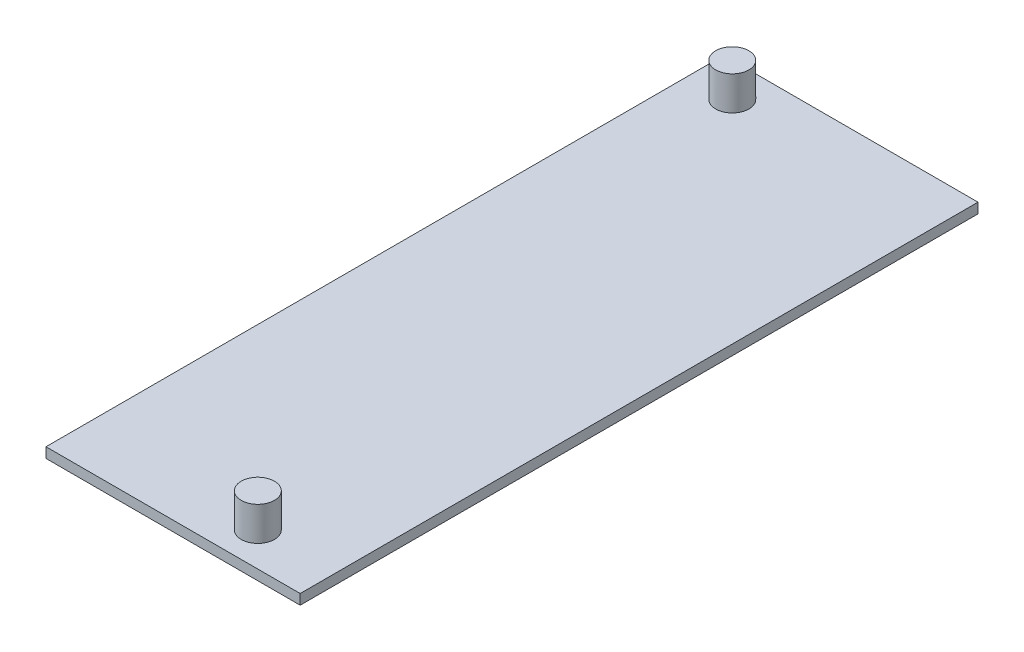
ISO-10303-21;
HEADER;
FILE_DESCRIPTION(('STEP AP214'),'2;1');
FILE_NAME('part.step','',(''),(''),'','','');
FILE_SCHEMA(('AUTOMOTIVE_DESIGN { 1 0 10303 214 1 1 1 1 }'));
ENDSEC;
DATA;
#1=APPLICATION_CONTEXT('core data for automotive mechanical design processes');
#2=APPLICATION_PROTOCOL_DEFINITION('international standard','automotive_design',2000,#1);
#3=PRODUCT_CONTEXT('',#1,'mechanical');
#4=PRODUCT('Part','Part','',(#3));
#5=PRODUCT_RELATED_PRODUCT_CATEGORY('part','',(#4));
#6=PRODUCT_DEFINITION_FORMATION('','',#4);
#7=PRODUCT_DEFINITION_CONTEXT('part definition',#1,'design');
#8=PRODUCT_DEFINITION('design','',#6,#7);
#9=PRODUCT_DEFINITION_SHAPE('','',#8);
#10=(LENGTH_UNIT() NAMED_UNIT(*) SI_UNIT(.MILLI.,.METRE.));
#11=(NAMED_UNIT(*) PLANE_ANGLE_UNIT() SI_UNIT($,.RADIAN.));
#12=(NAMED_UNIT(*) SI_UNIT($,.STERADIAN.) SOLID_ANGLE_UNIT());
#13=UNCERTAINTY_MEASURE_WITH_UNIT(LENGTH_MEASURE(1.E-05),#10,'distance_accuracy_value','');
#14=(GEOMETRIC_REPRESENTATION_CONTEXT(3) GLOBAL_UNCERTAINTY_ASSIGNED_CONTEXT((#13)) GLOBAL_UNIT_ASSIGNED_CONTEXT((#10,
#11,#12)) REPRESENTATION_CONTEXT('',''));
#15=CARTESIAN_POINT('',(0.,0.,0.));
#16=DIRECTION('',(0.,0.,1.));
#17=DIRECTION('',(1.,0.,0.));
#18=AXIS2_PLACEMENT_3D('',#15,#16,#17);
#19=CARTESIAN_POINT('',(0.,0.,200.));
#20=DIRECTION('',(1.,0.,0.));
#21=DIRECTION('',(0.,0.,-1.));
#22=AXIS2_PLACEMENT_3D('',#19,#20,#21);
#23=PLANE('',#22);
#24=DIRECTION('',(0.,-1.,0.));
#25=VECTOR('',#24,1.);
#26=CARTESIAN_POINT('',(0.,0.,0.));
#27=LINE('',#26,#25);
#28=CARTESIAN_POINT('',(0.,3.,0.));
#29=VERTEX_POINT('',#28);
#30=CARTESIAN_POINT('',(0.,0.,0.));
#31=VERTEX_POINT('',#30);
#32=EDGE_CURVE('E304',#29,#31,#27,.T.);
#33=ORIENTED_EDGE('',*,*,#32,.T.);
#34=DIRECTION('',(0.,0.,-1.));
#35=VECTOR('',#34,1.);
#36=CARTESIAN_POINT('',(0.,0.,200.));
#37=LINE('',#36,#35);
#38=CARTESIAN_POINT('',(0.,0.,200.));
#39=VERTEX_POINT('',#38);
#40=EDGE_CURVE('E333',#39,#31,#37,.T.);
#41=ORIENTED_EDGE('',*,*,#40,.F.);
#42=DIRECTION('',(0.,-1.,0.));
#43=VECTOR('',#42,1.);
#44=CARTESIAN_POINT('',(0.,0.,200.));
#45=LINE('',#44,#43);
#46=CARTESIAN_POINT('',(0.,3.,200.));
#47=VERTEX_POINT('',#46);
#48=EDGE_CURVE('E305',#47,#39,#45,.T.);
#49=ORIENTED_EDGE('',*,*,#48,.F.);
#50=DIRECTION('',(0.,0.,-1.));
#51=VECTOR('',#50,1.);
#52=CARTESIAN_POINT('',(0.,3.,200.));
#53=LINE('',#52,#51);
#54=EDGE_CURVE('E315',#47,#29,#53,.T.);
#55=ORIENTED_EDGE('',*,*,#54,.T.);
#56=EDGE_LOOP('',(#33,#41,#49,#55));
#57=FACE_BOUND('',#56,.T.);
#58=ADVANCED_FACE('F34',(#57),#23,.F.);
#59=CARTESIAN_POINT('',(0.,0.,200.));
#60=DIRECTION('',(0.,1.,0.));
#61=DIRECTION('',(0.,0.,1.));
#62=AXIS2_PLACEMENT_3D('',#59,#60,#61);
#63=PLANE('',#62);
#64=DIRECTION('',(1.,0.,0.));
#65=VECTOR('',#64,1.);
#66=CARTESIAN_POINT('',(25.,0.,150.));
#67=LINE('',#66,#65);
#68=CARTESIAN_POINT('',(25.,0.,150.));
#69=VERTEX_POINT('',#68);
#70=CARTESIAN_POINT('',(30.,0.,150.));
#71=VERTEX_POINT('',#70);
#72=EDGE_CURVE('E199',#69,#71,#67,.T.);
#73=ORIENTED_EDGE('',*,*,#72,.F.);
#74=DIRECTION('',(0.,0.,-1.));
#75=VECTOR('',#74,1.);
#76=CARTESIAN_POINT('',(25.,0.,180.));
#77=LINE('',#76,#75);
#78=CARTESIAN_POINT('',(25.,0.,180.));
#79=VERTEX_POINT('',#78);
#80=EDGE_CURVE('E48',#79,#69,#77,.T.);
#81=ORIENTED_EDGE('',*,*,#80,.F.);
#82=DIRECTION('',(-1.,0.,0.));
#83=VECTOR('',#82,1.);
#84=CARTESIAN_POINT('',(25.,0.,180.));
#85=LINE('',#84,#83);
#86=CARTESIAN_POINT('',(30.,0.,180.));
#87=VERTEX_POINT('',#86);
#88=EDGE_CURVE('E190',#87,#79,#85,.T.);
#89=ORIENTED_EDGE('',*,*,#88,.F.);
#90=DIRECTION('',(0.,0.,1.));
#91=VECTOR('',#90,1.);
#92=CARTESIAN_POINT('',(30.,0.,180.));
#93=LINE('',#92,#91);
#94=EDGE_CURVE('E193',#71,#87,#93,.T.);
#95=ORIENTED_EDGE('',*,*,#94,.F.);
#96=EDGE_LOOP('',(#73,#81,#89,#95));
#97=FACE_BOUND('',#96,.T.);
#98=DIRECTION('',(1.,0.,0.));
#99=VECTOR('',#98,1.);
#100=CARTESIAN_POINT('',(25.0000000000005,0.,100.));
#101=LINE('',#100,#99);
#102=CARTESIAN_POINT('',(25.0000000000005,0.,100.));
#103=VERTEX_POINT('',#102);
#104=CARTESIAN_POINT('',(30.0000000000005,0.,100.));
#105=VERTEX_POINT('',#104);
#106=EDGE_CURVE('E225',#103,#105,#101,.T.);
#107=ORIENTED_EDGE('',*,*,#106,.F.);
#108=DIRECTION('',(0.,0.,-1.));
#109=VECTOR('',#108,1.);
#110=CARTESIAN_POINT('',(25.0000000000005,0.,130.));
#111=LINE('',#110,#109);
#112=CARTESIAN_POINT('',(25.0000000000005,0.,130.));
#113=VERTEX_POINT('',#112);
#114=EDGE_CURVE('E56',#113,#103,#111,.T.);
#115=ORIENTED_EDGE('',*,*,#114,.F.);
#116=DIRECTION('',(-1.,0.,0.));
#117=VECTOR('',#116,1.);
#118=CARTESIAN_POINT('',(25.0000000000005,0.,130.));
#119=LINE('',#118,#117);
#120=CARTESIAN_POINT('',(30.0000000000005,0.,130.));
#121=VERTEX_POINT('',#120);
#122=EDGE_CURVE('E214',#121,#113,#119,.T.);
#123=ORIENTED_EDGE('',*,*,#122,.F.);
#124=DIRECTION('',(0.,0.,1.));
#125=VECTOR('',#124,1.);
#126=CARTESIAN_POINT('',(30.0000000000005,0.,130.));
#127=LINE('',#126,#125);
#128=EDGE_CURVE('E229',#105,#121,#127,.T.);
#129=ORIENTED_EDGE('',*,*,#128,.F.);
#130=EDGE_LOOP('',(#107,#115,#123,#129));
#131=FACE_BOUND('',#130,.T.);
#132=DIRECTION('',(1.,0.,0.));
#133=VECTOR('',#132,1.);
#134=CARTESIAN_POINT('',(25.000000000001,0.,50.));
#135=LINE('',#134,#133);
#136=CARTESIAN_POINT('',(25.000000000001,0.,50.));
#137=VERTEX_POINT('',#136);
#138=CARTESIAN_POINT('',(30.000000000001,0.,50.));
#139=VERTEX_POINT('',#138);
#140=EDGE_CURVE('E256',#137,#139,#135,.T.);
#141=ORIENTED_EDGE('',*,*,#140,.F.);
#142=DIRECTION('',(0.,0.,-1.));
#143=VECTOR('',#142,1.);
#144=CARTESIAN_POINT('',(25.000000000001,0.,80.));
#145=LINE('',#144,#143);
#146=CARTESIAN_POINT('',(25.000000000001,0.,80.));
#147=VERTEX_POINT('',#146);
#148=EDGE_CURVE('E254',#147,#137,#145,.T.);
#149=ORIENTED_EDGE('',*,*,#148,.F.);
#150=DIRECTION('',(-1.,0.,0.));
#151=VECTOR('',#150,1.);
#152=CARTESIAN_POINT('',(25.000000000001,0.,80.));
#153=LINE('',#152,#151);
#154=CARTESIAN_POINT('',(30.000000000001,0.,80.));
#155=VERTEX_POINT('',#154);
#156=EDGE_CURVE('E244',#155,#147,#153,.T.);
#157=ORIENTED_EDGE('',*,*,#156,.F.);
#158=DIRECTION('',(0.,0.,1.));
#159=VECTOR('',#158,1.);
#160=CARTESIAN_POINT('',(30.000000000001,0.,80.));
#161=LINE('',#160,#159);
#162=EDGE_CURVE('E260',#139,#155,#161,.T.);
#163=ORIENTED_EDGE('',*,*,#162,.F.);
#164=EDGE_LOOP('',(#141,#149,#157,#163));
#165=FACE_BOUND('',#164,.T.);
#166=DIRECTION('',(1.,0.,0.));
#167=VECTOR('',#166,1.);
#168=CARTESIAN_POINT('',(0.,0.,0.));
#169=LINE('',#168,#167);
#170=CARTESIAN_POINT('',(25.0000000000016,0.,0.));
#171=VERTEX_POINT('',#170);
#172=EDGE_CURVE('E319',#31,#171,#169,.T.);
#173=ORIENTED_EDGE('',*,*,#172,.T.);
#174=DIRECTION('',(0.,0.,-1.));
#175=VECTOR('',#174,1.);
#176=CARTESIAN_POINT('',(25.0000000000016,0.,30.0000000000001));
#177=LINE('',#176,#175);
#178=CARTESIAN_POINT('',(25.0000000000016,0.,30.0000000000001));
#179=VERTEX_POINT('',#178);
#180=EDGE_CURVE('E285',#179,#171,#177,.T.);
#181=ORIENTED_EDGE('',*,*,#180,.F.);
#182=DIRECTION('',(-1.,0.,0.));
#183=VECTOR('',#182,1.);
#184=CARTESIAN_POINT('',(25.0000000000016,0.,30.0000000000001));
#185=LINE('',#184,#183);
#186=CARTESIAN_POINT('',(30.0000000000016,0.,30.0000000000001));
#187=VERTEX_POINT('',#186);
#188=EDGE_CURVE('E275',#187,#179,#185,.T.);
#189=ORIENTED_EDGE('',*,*,#188,.F.);
#190=DIRECTION('',(0.,0.,1.));
#191=VECTOR('',#190,1.);
#192=CARTESIAN_POINT('',(30.0000000000016,0.,30.0000000000001));
#193=LINE('',#192,#191);
#194=CARTESIAN_POINT('',(30.0000000000016,0.,0.));
#195=VERTEX_POINT('',#194);
#196=EDGE_CURVE('E287',#195,#187,#193,.T.);
#197=ORIENTED_EDGE('',*,*,#196,.F.);
#198=CARTESIAN_POINT('',(75.,0.,0.));
#199=VERTEX_POINT('',#198);
#200=EDGE_CURVE('E318',#195,#199,#169,.T.);
#201=ORIENTED_EDGE('',*,*,#200,.T.);
#202=DIRECTION('',(0.,0.,-1.));
#203=VECTOR('',#202,1.);
#204=CARTESIAN_POINT('',(75.,0.,200.));
#205=LINE('',#204,#203);
#206=CARTESIAN_POINT('',(75.,0.,200.));
#207=VERTEX_POINT('',#206);
#208=EDGE_CURVE('E330',#207,#199,#205,.T.);
#209=ORIENTED_EDGE('',*,*,#208,.F.);
#210=DIRECTION('',(1.,0.,0.));
#211=VECTOR('',#210,1.);
#212=CARTESIAN_POINT('',(0.,0.,200.));
#213=LINE('',#212,#211);
#214=EDGE_CURVE('E308',#39,#207,#213,.T.);
#215=ORIENTED_EDGE('',*,*,#214,.F.);
#216=ORIENTED_EDGE('',*,*,#40,.T.);
#217=EDGE_LOOP('',(#173,#181,#189,#197,#201,#209,#215,#216));
#218=FACE_BOUND('',#217,.T.);
#219=ADVANCED_FACE('F362',(#97,#131,#165,#218),#63,.F.);
#220=CARTESIAN_POINT('',(75.,0.,200.));
#221=DIRECTION('',(-1.,0.,0.));
#222=DIRECTION('',(0.,0.,1.));
#223=AXIS2_PLACEMENT_3D('',#220,#221,#222);
#224=PLANE('',#223);
#225=DIRECTION('',(0.,1.,0.));
#226=VECTOR('',#225,1.);
#227=CARTESIAN_POINT('',(75.,0.,0.));
#228=LINE('',#227,#226);
#229=CARTESIAN_POINT('',(75.,3.,0.));
#230=VERTEX_POINT('',#229);
#231=EDGE_CURVE('E322',#199,#230,#228,.T.);
#232=ORIENTED_EDGE('',*,*,#231,.T.);
#233=DIRECTION('',(0.,0.,-1.));
#234=VECTOR('',#233,1.);
#235=CARTESIAN_POINT('',(75.,3.,200.));
#236=LINE('',#235,#234);
#237=CARTESIAN_POINT('',(75.,3.,200.));
#238=VERTEX_POINT('',#237);
#239=EDGE_CURVE('E327',#238,#230,#236,.T.);
#240=ORIENTED_EDGE('',*,*,#239,.F.);
#241=DIRECTION('',(0.,1.,0.));
#242=VECTOR('',#241,1.);
#243=CARTESIAN_POINT('',(75.,0.,200.));
#244=LINE('',#243,#242);
#245=EDGE_CURVE('E311',#207,#238,#244,.T.);
#246=ORIENTED_EDGE('',*,*,#245,.F.);
#247=ORIENTED_EDGE('',*,*,#208,.T.);
#248=EDGE_LOOP('',(#232,#240,#246,#247));
#249=FACE_BOUND('',#248,.T.);
#250=ADVANCED_FACE('F344',(#249),#224,.F.);
#251=CARTESIAN_POINT('',(0.,3.,200.));
#252=DIRECTION('',(0.,-1.,0.));
#253=DIRECTION('',(0.,0.,-1.));
#254=AXIS2_PLACEMENT_3D('',#251,#252,#253);
#255=PLANE('',#254);
#256=CARTESIAN_POINT('',(52.5,3.,190.));
#257=DIRECTION('',(0.,-1.,0.));
#258=DIRECTION('',(0.,0.,-1.));
#259=AXIS2_PLACEMENT_3D('',#256,#257,#258);
#260=CIRCLE('',#259,4.9);
#261=CARTESIAN_POINT('',(52.5,3.,185.1));
#262=VERTEX_POINT('',#261);
#263=EDGE_CURVE('E11',#262,#262,#260,.F.);
#264=ORIENTED_EDGE('',*,*,#263,.F.);
#265=EDGE_LOOP('',(#264));
#266=FACE_BOUND('',#265,.T.);
#267=CARTESIAN_POINT('',(12.5,3.,10.));
#268=DIRECTION('',(0.,-1.,0.));
#269=DIRECTION('',(0.,0.,-1.));
#270=AXIS2_PLACEMENT_3D('',#267,#268,#269);
#271=CIRCLE('',#270,4.9);
#272=CARTESIAN_POINT('',(12.5,3.,5.1));
#273=VERTEX_POINT('',#272);
#274=EDGE_CURVE('E41',#273,#273,#271,.F.);
#275=ORIENTED_EDGE('',*,*,#274,.F.);
#276=EDGE_LOOP('',(#275));
#277=FACE_BOUND('',#276,.T.);
#278=DIRECTION('',(-1.,0.,0.));
#279=VECTOR('',#278,1.);
#280=CARTESIAN_POINT('',(0.,3.,0.));
#281=LINE('',#280,#279);
#282=EDGE_CURVE('E309',#230,#29,#281,.T.);
#283=ORIENTED_EDGE('',*,*,#282,.T.);
#284=ORIENTED_EDGE('',*,*,#54,.F.);
#285=DIRECTION('',(-1.,0.,0.));
#286=VECTOR('',#285,1.);
#287=CARTESIAN_POINT('',(0.,3.,200.));
#288=LINE('',#287,#286);
#289=EDGE_CURVE('E313',#238,#47,#288,.T.);
#290=ORIENTED_EDGE('',*,*,#289,.F.);
#291=ORIENTED_EDGE('',*,*,#239,.T.);
#292=EDGE_LOOP('',(#283,#284,#290,#291));
#293=FACE_BOUND('',#292,.T.);
#294=ADVANCED_FACE('F340',(#266,#277,#293),#255,.F.);
#295=CARTESIAN_POINT('',(0.,0.,200.));
#296=DIRECTION('',(0.,0.,-1.));
#297=DIRECTION('',(-1.,0.,0.));
#298=AXIS2_PLACEMENT_3D('',#295,#296,#297);
#299=PLANE('',#298);
#300=ORIENTED_EDGE('',*,*,#48,.T.);
#301=ORIENTED_EDGE('',*,*,#214,.T.);
#302=ORIENTED_EDGE('',*,*,#245,.T.);
#303=ORIENTED_EDGE('',*,*,#289,.T.);
#304=EDGE_LOOP('',(#300,#301,#302,#303));
#305=FACE_BOUND('',#304,.T.);
#306=ADVANCED_FACE('F343',(#305),#299,.F.);
#307=CARTESIAN_POINT('',(0.,0.,0.));
#308=DIRECTION('',(0.,0.,-1.));
#309=DIRECTION('',(-1.,0.,0.));
#310=AXIS2_PLACEMENT_3D('',#307,#308,#309);
#311=PLANE('',#310);
#312=DIRECTION('',(0.,-1.,0.));
#313=VECTOR('',#312,1.);
#314=CARTESIAN_POINT('',(25.0000000000016,1.,0.));
#315=LINE('',#314,#313);
#316=CARTESIAN_POINT('',(25.0000000000016,1.,0.));
#317=VERTEX_POINT('',#316);
#318=EDGE_CURVE('E284',#317,#171,#315,.T.);
#319=ORIENTED_EDGE('',*,*,#318,.T.);
#320=ORIENTED_EDGE('',*,*,#172,.F.);
#321=ORIENTED_EDGE('',*,*,#32,.F.);
#322=ORIENTED_EDGE('',*,*,#282,.F.);
#323=ORIENTED_EDGE('',*,*,#231,.F.);
#324=ORIENTED_EDGE('',*,*,#200,.F.);
#325=DIRECTION('',(0.,-1.,0.));
#326=VECTOR('',#325,1.);
#327=CARTESIAN_POINT('',(30.0000000000016,1.,0.));
#328=LINE('',#327,#326);
#329=CARTESIAN_POINT('',(30.0000000000016,1.,0.));
#330=VERTEX_POINT('',#329);
#331=EDGE_CURVE('E295',#330,#195,#328,.T.);
#332=ORIENTED_EDGE('',*,*,#331,.F.);
#333=DIRECTION('',(1.,0.,0.));
#334=VECTOR('',#333,1.);
#335=CARTESIAN_POINT('',(25.0000000000016,1.,0.));
#336=LINE('',#335,#334);
#337=EDGE_CURVE('E274',#317,#330,#336,.T.);
#338=ORIENTED_EDGE('',*,*,#337,.F.);
#339=EDGE_LOOP('',(#319,#320,#321,#322,#323,#324,#332,#338));
#340=FACE_BOUND('',#339,.T.);
#341=ADVANCED_FACE('F357',(#340),#311,.T.);
#342=CARTESIAN_POINT('',(12.5,13.,10.));
#343=DIRECTION('',(0.,-1.,0.));
#344=DIRECTION('',(0.,0.,-1.));
#345=AXIS2_PLACEMENT_3D('',#342,#343,#344);
#346=CYLINDRICAL_SURFACE('',#345,4.9);
#347=CARTESIAN_POINT('',(12.5,13.,10.));
#348=DIRECTION('',(0.,1.,0.));
#349=DIRECTION('',(0.,0.,1.));
#350=AXIS2_PLACEMENT_3D('',#347,#348,#349);
#351=CIRCLE('',#350,4.9);
#352=CARTESIAN_POINT('',(12.5,13.,14.9));
#353=VERTEX_POINT('',#352);
#354=EDGE_CURVE('E301',#353,#353,#351,.T.);
#355=ORIENTED_EDGE('',*,*,#354,.F.);
#356=EDGE_LOOP('',(#355));
#357=FACE_BOUND('',#356,.T.);
#358=ORIENTED_EDGE('',*,*,#274,.T.);
#359=EDGE_LOOP('',(#358));
#360=FACE_BOUND('',#359,.T.);
#361=ADVANCED_FACE('F338',(#357,#360),#346,.T.);
#362=CARTESIAN_POINT('',(0.,13.,0.));
#363=DIRECTION('',(0.,1.,0.));
#364=DIRECTION('',(0.,0.,1.));
#365=AXIS2_PLACEMENT_3D('',#362,#363,#364);
#366=PLANE('',#365);
#367=ORIENTED_EDGE('',*,*,#354,.T.);
#368=EDGE_LOOP('',(#367));
#369=FACE_BOUND('',#368,.T.);
#370=ADVANCED_FACE('F408',(#369),#366,.T.);
#371=CARTESIAN_POINT('',(52.5,13.,190.));
#372=DIRECTION('',(0.,-1.,0.));
#373=DIRECTION('',(0.,0.,-1.));
#374=AXIS2_PLACEMENT_3D('',#371,#372,#373);
#375=CYLINDRICAL_SURFACE('',#374,4.9);
#376=CARTESIAN_POINT('',(52.5,13.,190.));
#377=DIRECTION('',(0.,1.,0.));
#378=DIRECTION('',(0.,0.,1.));
#379=AXIS2_PLACEMENT_3D('',#376,#377,#378);
#380=CIRCLE('',#379,4.9);
#381=CARTESIAN_POINT('',(52.5,13.,194.9));
#382=VERTEX_POINT('',#381);
#383=EDGE_CURVE('E206',#382,#382,#380,.T.);
#384=ORIENTED_EDGE('',*,*,#383,.F.);
#385=EDGE_LOOP('',(#384));
#386=FACE_BOUND('',#385,.T.);
#387=ORIENTED_EDGE('',*,*,#263,.T.);
#388=EDGE_LOOP('',(#387));
#389=FACE_BOUND('',#388,.T.);
#390=ADVANCED_FACE('F412',(#386,#389),#375,.T.);
#391=CARTESIAN_POINT('',(52.5,13.,190.));
#392=DIRECTION('',(0.,1.,0.));
#393=DIRECTION('',(0.,0.,1.));
#394=AXIS2_PLACEMENT_3D('',#391,#392,#393);
#395=PLANE('',#394);
#396=ORIENTED_EDGE('',*,*,#383,.T.);
#397=EDGE_LOOP('',(#396));
#398=FACE_BOUND('',#397,.T.);
#399=ADVANCED_FACE('F388',(#398),#395,.T.);
#400=CARTESIAN_POINT('',(25.0000000000016,1.,30.0000000000001));
#401=DIRECTION('',(-1.,0.,0.));
#402=DIRECTION('',(0.,0.,1.));
#403=AXIS2_PLACEMENT_3D('',#400,#401,#402);
#404=PLANE('',#403);
#405=ORIENTED_EDGE('',*,*,#180,.T.);
#406=ORIENTED_EDGE('',*,*,#318,.F.);
#407=DIRECTION('',(0.,0.,-1.));
#408=VECTOR('',#407,1.);
#409=CARTESIAN_POINT('',(25.0000000000016,1.,30.0000000000001));
#410=LINE('',#409,#408);
#411=CARTESIAN_POINT('',(25.0000000000016,1.,30.0000000000001));
#412=VERTEX_POINT('',#411);
#413=EDGE_CURVE('E272',#412,#317,#410,.T.);
#414=ORIENTED_EDGE('',*,*,#413,.F.);
#415=DIRECTION('',(0.,-1.,0.));
#416=VECTOR('',#415,1.);
#417=CARTESIAN_POINT('',(25.0000000000016,1.,30.0000000000001));
#418=LINE('',#417,#416);
#419=EDGE_CURVE('E257',#412,#179,#418,.T.);
#420=ORIENTED_EDGE('',*,*,#419,.T.);
#421=EDGE_LOOP('',(#405,#406,#414,#420));
#422=FACE_BOUND('',#421,.T.);
#423=ADVANCED_FACE('F378',(#422),#404,.F.);
#424=CARTESIAN_POINT('',(25.0000000000016,1.,30.0000000000001));
#425=DIRECTION('',(0.,0.,1.));
#426=DIRECTION('',(1.,0.,0.));
#427=AXIS2_PLACEMENT_3D('',#424,#425,#426);
#428=PLANE('',#427);
#429=ORIENTED_EDGE('',*,*,#188,.T.);
#430=ORIENTED_EDGE('',*,*,#419,.F.);
#431=DIRECTION('',(-1.,0.,0.));
#432=VECTOR('',#431,1.);
#433=CARTESIAN_POINT('',(25.0000000000016,1.,30.0000000000001));
#434=LINE('',#433,#432);
#435=CARTESIAN_POINT('',(30.0000000000016,1.,30.0000000000001));
#436=VERTEX_POINT('',#435);
#437=EDGE_CURVE('E281',#436,#412,#434,.T.);
#438=ORIENTED_EDGE('',*,*,#437,.F.);
#439=DIRECTION('',(0.,-1.,0.));
#440=VECTOR('',#439,1.);
#441=CARTESIAN_POINT('',(30.0000000000016,1.,30.0000000000001));
#442=LINE('',#441,#440);
#443=EDGE_CURVE('E293',#436,#187,#442,.T.);
#444=ORIENTED_EDGE('',*,*,#443,.T.);
#445=EDGE_LOOP('',(#429,#430,#438,#444));
#446=FACE_BOUND('',#445,.T.);
#447=ADVANCED_FACE('F380',(#446),#428,.F.);
#448=CARTESIAN_POINT('',(30.0000000000016,1.,30.0000000000001));
#449=DIRECTION('',(1.,0.,0.));
#450=DIRECTION('',(0.,0.,-1.));
#451=AXIS2_PLACEMENT_3D('',#448,#449,#450);
#452=PLANE('',#451);
#453=ORIENTED_EDGE('',*,*,#196,.T.);
#454=ORIENTED_EDGE('',*,*,#443,.F.);
#455=DIRECTION('',(0.,0.,1.));
#456=VECTOR('',#455,1.);
#457=CARTESIAN_POINT('',(30.0000000000016,1.,30.0000000000001));
#458=LINE('',#457,#456);
#459=EDGE_CURVE('E278',#330,#436,#458,.T.);
#460=ORIENTED_EDGE('',*,*,#459,.F.);
#461=ORIENTED_EDGE('',*,*,#331,.T.);
#462=EDGE_LOOP('',(#453,#454,#460,#461));
#463=FACE_BOUND('',#462,.T.);
#464=ADVANCED_FACE('F372',(#463),#452,.F.);
#465=CARTESIAN_POINT('',(0.,1.,0.));
#466=DIRECTION('',(0.,-1.,0.));
#467=DIRECTION('',(0.,0.,-1.));
#468=AXIS2_PLACEMENT_3D('',#465,#466,#467);
#469=PLANE('',#468);
#470=ORIENTED_EDGE('',*,*,#413,.T.);
#471=ORIENTED_EDGE('',*,*,#337,.T.);
#472=ORIENTED_EDGE('',*,*,#459,.T.);
#473=ORIENTED_EDGE('',*,*,#437,.T.);
#474=EDGE_LOOP('',(#470,#471,#472,#473));
#475=FACE_BOUND('',#474,.T.);
#476=ADVANCED_FACE('F375',(#475),#469,.T.);
#477=CARTESIAN_POINT('',(25.000000000001,1.,80.));
#478=DIRECTION('',(-1.,0.,0.));
#479=DIRECTION('',(0.,0.,1.));
#480=AXIS2_PLACEMENT_3D('',#477,#478,#479);
#481=PLANE('',#480);
#482=ORIENTED_EDGE('',*,*,#148,.T.);
#483=DIRECTION('',(0.,-1.,0.));
#484=VECTOR('',#483,1.);
#485=CARTESIAN_POINT('',(25.000000000001,1.,50.));
#486=LINE('',#485,#484);
#487=CARTESIAN_POINT('',(25.000000000001,1.,50.));
#488=VERTEX_POINT('',#487);
#489=EDGE_CURVE('E253',#488,#137,#486,.T.);
#490=ORIENTED_EDGE('',*,*,#489,.F.);
#491=DIRECTION('',(0.,0.,-1.));
#492=VECTOR('',#491,1.);
#493=CARTESIAN_POINT('',(25.000000000001,1.,80.));
#494=LINE('',#493,#492);
#495=CARTESIAN_POINT('',(25.000000000001,1.,80.));
#496=VERTEX_POINT('',#495);
#497=EDGE_CURVE('E240',#496,#488,#494,.T.);
#498=ORIENTED_EDGE('',*,*,#497,.F.);
#499=DIRECTION('',(0.,-1.,0.));
#500=VECTOR('',#499,1.);
#501=CARTESIAN_POINT('',(25.000000000001,1.,80.));
#502=LINE('',#501,#500);
#503=EDGE_CURVE('E226',#496,#147,#502,.T.);
#504=ORIENTED_EDGE('',*,*,#503,.T.);
#505=EDGE_LOOP('',(#482,#490,#498,#504));
#506=FACE_BOUND('',#505,.T.);
#507=ADVANCED_FACE('F456',(#506),#481,.F.);
#508=CARTESIAN_POINT('',(25.000000000001,1.,80.));
#509=DIRECTION('',(0.,0.,1.));
#510=DIRECTION('',(1.,0.,0.));
#511=AXIS2_PLACEMENT_3D('',#508,#509,#510);
#512=PLANE('',#511);
#513=ORIENTED_EDGE('',*,*,#156,.T.);
#514=ORIENTED_EDGE('',*,*,#503,.F.);
#515=DIRECTION('',(-1.,0.,0.));
#516=VECTOR('',#515,1.);
#517=CARTESIAN_POINT('',(25.000000000001,1.,80.));
#518=LINE('',#517,#516);
#519=CARTESIAN_POINT('',(30.000000000001,1.,80.));
#520=VERTEX_POINT('',#519);
#521=EDGE_CURVE('E250',#520,#496,#518,.T.);
#522=ORIENTED_EDGE('',*,*,#521,.F.);
#523=DIRECTION('',(0.,-1.,0.));
#524=VECTOR('',#523,1.);
#525=CARTESIAN_POINT('',(30.000000000001,1.,80.));
#526=LINE('',#525,#524);
#527=EDGE_CURVE('E266',#520,#155,#526,.T.);
#528=ORIENTED_EDGE('',*,*,#527,.T.);
#529=EDGE_LOOP('',(#513,#514,#522,#528));
#530=FACE_BOUND('',#529,.T.);
#531=ADVANCED_FACE('F464',(#530),#512,.F.);
#532=CARTESIAN_POINT('',(30.000000000001,1.,80.));
#533=DIRECTION('',(1.,0.,0.));
#534=DIRECTION('',(0.,0.,-1.));
#535=AXIS2_PLACEMENT_3D('',#532,#533,#534);
#536=PLANE('',#535);
#537=ORIENTED_EDGE('',*,*,#162,.T.);
#538=ORIENTED_EDGE('',*,*,#527,.F.);
#539=DIRECTION('',(0.,0.,1.));
#540=VECTOR('',#539,1.);
#541=CARTESIAN_POINT('',(30.000000000001,1.,80.));
#542=LINE('',#541,#540);
#543=CARTESIAN_POINT('',(30.000000000001,1.,50.));
#544=VERTEX_POINT('',#543);
#545=EDGE_CURVE('E247',#544,#520,#542,.T.);
#546=ORIENTED_EDGE('',*,*,#545,.F.);
#547=DIRECTION('',(0.,-1.,0.));
#548=VECTOR('',#547,1.);
#549=CARTESIAN_POINT('',(30.000000000001,1.,50.));
#550=LINE('',#549,#548);
#551=EDGE_CURVE('E268',#544,#139,#550,.T.);
#552=ORIENTED_EDGE('',*,*,#551,.T.);
#553=EDGE_LOOP('',(#537,#538,#546,#552));
#554=FACE_BOUND('',#553,.T.);
#555=ADVANCED_FACE('F474',(#554),#536,.F.);
#556=CARTESIAN_POINT('',(25.000000000001,1.,50.));
#557=DIRECTION('',(0.,0.,-1.));
#558=DIRECTION('',(-1.,0.,0.));
#559=AXIS2_PLACEMENT_3D('',#556,#557,#558);
#560=PLANE('',#559);
#561=ORIENTED_EDGE('',*,*,#140,.T.);
#562=ORIENTED_EDGE('',*,*,#551,.F.);
#563=DIRECTION('',(1.,0.,0.));
#564=VECTOR('',#563,1.);
#565=CARTESIAN_POINT('',(25.000000000001,1.,50.));
#566=LINE('',#565,#564);
#567=EDGE_CURVE('E243',#488,#544,#566,.T.);
#568=ORIENTED_EDGE('',*,*,#567,.F.);
#569=ORIENTED_EDGE('',*,*,#489,.T.);
#570=EDGE_LOOP('',(#561,#562,#568,#569));
#571=FACE_BOUND('',#570,.T.);
#572=ADVANCED_FACE('F484',(#571),#560,.F.);
#573=CARTESIAN_POINT('',(0.,1.,0.));
#574=DIRECTION('',(0.,-1.,0.));
#575=DIRECTION('',(0.,0.,-1.));
#576=AXIS2_PLACEMENT_3D('',#573,#574,#575);
#577=PLANE('',#576);
#578=ORIENTED_EDGE('',*,*,#497,.T.);
#579=ORIENTED_EDGE('',*,*,#567,.T.);
#580=ORIENTED_EDGE('',*,*,#545,.T.);
#581=ORIENTED_EDGE('',*,*,#521,.T.);
#582=EDGE_LOOP('',(#578,#579,#580,#581));
#583=FACE_BOUND('',#582,.T.);
#584=ADVANCED_FACE('F494',(#583),#577,.T.);
#585=CARTESIAN_POINT('',(25.0000000000005,1.,130.));
#586=DIRECTION('',(-1.,0.,0.));
#587=DIRECTION('',(0.,0.,1.));
#588=AXIS2_PLACEMENT_3D('',#585,#586,#587);
#589=PLANE('',#588);
#590=ORIENTED_EDGE('',*,*,#114,.T.);
#591=DIRECTION('',(0.,-1.,0.));
#592=VECTOR('',#591,1.);
#593=CARTESIAN_POINT('',(25.0000000000005,1.,100.));
#594=LINE('',#593,#592);
#595=CARTESIAN_POINT('',(25.0000000000005,1.,100.));
#596=VERTEX_POINT('',#595);
#597=EDGE_CURVE('E223',#596,#103,#594,.T.);
#598=ORIENTED_EDGE('',*,*,#597,.F.);
#599=DIRECTION('',(0.,0.,-1.));
#600=VECTOR('',#599,1.);
#601=CARTESIAN_POINT('',(25.0000000000005,1.,130.));
#602=LINE('',#601,#600);
#603=CARTESIAN_POINT('',(25.0000000000005,1.,130.));
#604=VERTEX_POINT('',#603);
#605=EDGE_CURVE('E210',#604,#596,#602,.T.);
#606=ORIENTED_EDGE('',*,*,#605,.F.);
#607=DIRECTION('',(0.,-1.,0.));
#608=VECTOR('',#607,1.);
#609=CARTESIAN_POINT('',(25.0000000000005,1.,130.));
#610=LINE('',#609,#608);
#611=EDGE_CURVE('E200',#604,#113,#610,.T.);
#612=ORIENTED_EDGE('',*,*,#611,.T.);
#613=EDGE_LOOP('',(#590,#598,#606,#612));
#614=FACE_BOUND('',#613,.T.);
#615=ADVANCED_FACE('F504',(#614),#589,.F.);
#616=CARTESIAN_POINT('',(25.0000000000005,1.,130.));
#617=DIRECTION('',(0.,0.,1.));
#618=DIRECTION('',(1.,0.,0.));
#619=AXIS2_PLACEMENT_3D('',#616,#617,#618);
#620=PLANE('',#619);
#621=ORIENTED_EDGE('',*,*,#122,.T.);
#622=ORIENTED_EDGE('',*,*,#611,.F.);
#623=DIRECTION('',(-1.,0.,0.));
#624=VECTOR('',#623,1.);
#625=CARTESIAN_POINT('',(25.0000000000005,1.,130.));
#626=LINE('',#625,#624);
#627=CARTESIAN_POINT('',(30.0000000000005,1.,130.));
#628=VERTEX_POINT('',#627);
#629=EDGE_CURVE('E220',#628,#604,#626,.T.);
#630=ORIENTED_EDGE('',*,*,#629,.F.);
#631=DIRECTION('',(0.,-1.,0.));
#632=VECTOR('',#631,1.);
#633=CARTESIAN_POINT('',(30.0000000000005,1.,130.));
#634=LINE('',#633,#632);
#635=EDGE_CURVE('E235',#628,#121,#634,.T.);
#636=ORIENTED_EDGE('',*,*,#635,.T.);
#637=EDGE_LOOP('',(#621,#622,#630,#636));
#638=FACE_BOUND('',#637,.T.);
#639=ADVANCED_FACE('F514',(#638),#620,.F.);
#640=CARTESIAN_POINT('',(30.0000000000005,1.,130.));
#641=DIRECTION('',(1.,0.,0.));
#642=DIRECTION('',(0.,0.,-1.));
#643=AXIS2_PLACEMENT_3D('',#640,#641,#642);
#644=PLANE('',#643);
#645=ORIENTED_EDGE('',*,*,#128,.T.);
#646=ORIENTED_EDGE('',*,*,#635,.F.);
#647=DIRECTION('',(0.,0.,1.));
#648=VECTOR('',#647,1.);
#649=CARTESIAN_POINT('',(30.0000000000005,1.,130.));
#650=LINE('',#649,#648);
#651=CARTESIAN_POINT('',(30.0000000000005,1.,100.));
#652=VERTEX_POINT('',#651);
#653=EDGE_CURVE('E217',#652,#628,#650,.T.);
#654=ORIENTED_EDGE('',*,*,#653,.F.);
#655=DIRECTION('',(0.,-1.,0.));
#656=VECTOR('',#655,1.);
#657=CARTESIAN_POINT('',(30.0000000000005,1.,100.));
#658=LINE('',#657,#656);
#659=EDGE_CURVE('E237',#652,#105,#658,.T.);
#660=ORIENTED_EDGE('',*,*,#659,.T.);
#661=EDGE_LOOP('',(#645,#646,#654,#660));
#662=FACE_BOUND('',#661,.T.);
#663=ADVANCED_FACE('F523',(#662),#644,.F.);
#664=CARTESIAN_POINT('',(25.0000000000005,1.,100.));
#665=DIRECTION('',(0.,0.,-1.));
#666=DIRECTION('',(-1.,0.,0.));
#667=AXIS2_PLACEMENT_3D('',#664,#665,#666);
#668=PLANE('',#667);
#669=ORIENTED_EDGE('',*,*,#106,.T.);
#670=ORIENTED_EDGE('',*,*,#659,.F.);
#671=DIRECTION('',(1.,0.,0.));
#672=VECTOR('',#671,1.);
#673=CARTESIAN_POINT('',(25.0000000000005,1.,100.));
#674=LINE('',#673,#672);
#675=EDGE_CURVE('E213',#596,#652,#674,.T.);
#676=ORIENTED_EDGE('',*,*,#675,.F.);
#677=ORIENTED_EDGE('',*,*,#597,.T.);
#678=EDGE_LOOP('',(#669,#670,#676,#677));
#679=FACE_BOUND('',#678,.T.);
#680=ADVANCED_FACE('F533',(#679),#668,.F.);
#681=CARTESIAN_POINT('',(0.,1.,0.));
#682=DIRECTION('',(0.,-1.,0.));
#683=DIRECTION('',(0.,0.,-1.));
#684=AXIS2_PLACEMENT_3D('',#681,#682,#683);
#685=PLANE('',#684);
#686=ORIENTED_EDGE('',*,*,#605,.T.);
#687=ORIENTED_EDGE('',*,*,#675,.T.);
#688=ORIENTED_EDGE('',*,*,#653,.T.);
#689=ORIENTED_EDGE('',*,*,#629,.T.);
#690=EDGE_LOOP('',(#686,#687,#688,#689));
#691=FACE_BOUND('',#690,.T.);
#692=ADVANCED_FACE('F543',(#691),#685,.T.);
#693=CARTESIAN_POINT('',(25.,1.,180.));
#694=DIRECTION('',(-1.,0.,0.));
#695=DIRECTION('',(0.,0.,1.));
#696=AXIS2_PLACEMENT_3D('',#693,#694,#695);
#697=PLANE('',#696);
#698=ORIENTED_EDGE('',*,*,#80,.T.);
#699=DIRECTION('',(0.,-1.,0.));
#700=VECTOR('',#699,1.);
#701=CARTESIAN_POINT('',(25.,1.,150.));
#702=LINE('',#701,#700);
#703=CARTESIAN_POINT('',(25.,1.,150.));
#704=VERTEX_POINT('',#703);
#705=EDGE_CURVE('E168',#704,#69,#702,.T.);
#706=ORIENTED_EDGE('',*,*,#705,.F.);
#707=DIRECTION('',(0.,0.,-1.));
#708=VECTOR('',#707,1.);
#709=CARTESIAN_POINT('',(25.,1.,180.));
#710=LINE('',#709,#708);
#711=CARTESIAN_POINT('',(25.,1.,180.));
#712=VERTEX_POINT('',#711);
#713=EDGE_CURVE('E172',#712,#704,#710,.T.);
#714=ORIENTED_EDGE('',*,*,#713,.F.);
#715=DIRECTION('',(0.,-1.,0.));
#716=VECTOR('',#715,1.);
#717=CARTESIAN_POINT('',(25.,1.,180.));
#718=LINE('',#717,#716);
#719=EDGE_CURVE('E204',#712,#79,#718,.T.);
#720=ORIENTED_EDGE('',*,*,#719,.T.);
#721=EDGE_LOOP('',(#698,#706,#714,#720));
#722=FACE_BOUND('',#721,.T.);
#723=ADVANCED_FACE('F170',(#722),#697,.F.);
#724=CARTESIAN_POINT('',(25.,1.,180.));
#725=DIRECTION('',(0.,0.,1.));
#726=DIRECTION('',(1.,0.,0.));
#727=AXIS2_PLACEMENT_3D('',#724,#725,#726);
#728=PLANE('',#727);
#729=ORIENTED_EDGE('',*,*,#88,.T.);
#730=ORIENTED_EDGE('',*,*,#719,.F.);
#731=DIRECTION('',(-1.,0.,0.));
#732=VECTOR('',#731,1.);
#733=CARTESIAN_POINT('',(25.,1.,180.));
#734=LINE('',#733,#732);
#735=CARTESIAN_POINT('',(30.,1.,180.));
#736=VERTEX_POINT('',#735);
#737=EDGE_CURVE('E178',#736,#712,#734,.T.);
#738=ORIENTED_EDGE('',*,*,#737,.F.);
#739=DIRECTION('',(0.,-1.,0.));
#740=VECTOR('',#739,1.);
#741=CARTESIAN_POINT('',(30.,1.,180.));
#742=LINE('',#741,#740);
#743=EDGE_CURVE('E207',#736,#87,#742,.T.);
#744=ORIENTED_EDGE('',*,*,#743,.T.);
#745=EDGE_LOOP('',(#729,#730,#738,#744));
#746=FACE_BOUND('',#745,.T.);
#747=ADVANCED_FACE('F562',(#746),#728,.F.);
#748=CARTESIAN_POINT('',(30.,1.,180.));
#749=DIRECTION('',(1.,0.,0.));
#750=DIRECTION('',(0.,0.,-1.));
#751=AXIS2_PLACEMENT_3D('',#748,#749,#750);
#752=PLANE('',#751);
#753=ORIENTED_EDGE('',*,*,#94,.T.);
#754=ORIENTED_EDGE('',*,*,#743,.F.);
#755=DIRECTION('',(0.,0.,1.));
#756=VECTOR('',#755,1.);
#757=CARTESIAN_POINT('',(30.,1.,180.));
#758=LINE('',#757,#756);
#759=CARTESIAN_POINT('',(30.,1.,150.));
#760=VERTEX_POINT('',#759);
#761=EDGE_CURVE('E186',#760,#736,#758,.T.);
#762=ORIENTED_EDGE('',*,*,#761,.F.);
#763=DIRECTION('',(0.,-1.,0.));
#764=VECTOR('',#763,1.);
#765=CARTESIAN_POINT('',(30.,1.,150.));
#766=LINE('',#765,#764);
#767=EDGE_CURVE('E177',#760,#71,#766,.T.);
#768=ORIENTED_EDGE('',*,*,#767,.T.);
#769=EDGE_LOOP('',(#753,#754,#762,#768));
#770=FACE_BOUND('',#769,.T.);
#771=ADVANCED_FACE('F571',(#770),#752,.F.);
#772=CARTESIAN_POINT('',(25.,1.,150.));
#773=DIRECTION('',(0.,0.,-1.));
#774=DIRECTION('',(-1.,0.,0.));
#775=AXIS2_PLACEMENT_3D('',#772,#773,#774);
#776=PLANE('',#775);
#777=ORIENTED_EDGE('',*,*,#72,.T.);
#778=ORIENTED_EDGE('',*,*,#767,.F.);
#779=DIRECTION('',(1.,0.,0.));
#780=VECTOR('',#779,1.);
#781=CARTESIAN_POINT('',(25.,1.,150.));
#782=LINE('',#781,#780);
#783=EDGE_CURVE('E181',#704,#760,#782,.T.);
#784=ORIENTED_EDGE('',*,*,#783,.F.);
#785=ORIENTED_EDGE('',*,*,#705,.T.);
#786=EDGE_LOOP('',(#777,#778,#784,#785));
#787=FACE_BOUND('',#786,.T.);
#788=ADVANCED_FACE('F182',(#787),#776,.F.);
#789=CARTESIAN_POINT('',(0.,1.,0.));
#790=DIRECTION('',(0.,-1.,0.));
#791=DIRECTION('',(0.,0.,-1.));
#792=AXIS2_PLACEMENT_3D('',#789,#790,#791);
#793=PLANE('',#792);
#794=ORIENTED_EDGE('',*,*,#713,.T.);
#795=ORIENTED_EDGE('',*,*,#783,.T.);
#796=ORIENTED_EDGE('',*,*,#761,.T.);
#797=ORIENTED_EDGE('',*,*,#737,.T.);
#798=EDGE_LOOP('',(#794,#795,#796,#797));
#799=FACE_BOUND('',#798,.T.);
#800=ADVANCED_FACE('F188',(#799),#793,.T.);
#801=CLOSED_SHELL('',(#58,#219,#250,#294,#306,#341,#361,#370,#390,#399,#423,#447,#464,#476,#507,
#531,#555,#572,#584,#615,#639,#663,#680,#692,#723,#747,#771,#788,#800));
#802=MANIFOLD_SOLID_BREP('B2',#801);
#803=ADVANCED_BREP_SHAPE_REPRESENTATION('',(#18,#802),#14);
#804=SHAPE_DEFINITION_REPRESENTATION(#9,#803);
ENDSEC;
END-ISO-10303-21;
